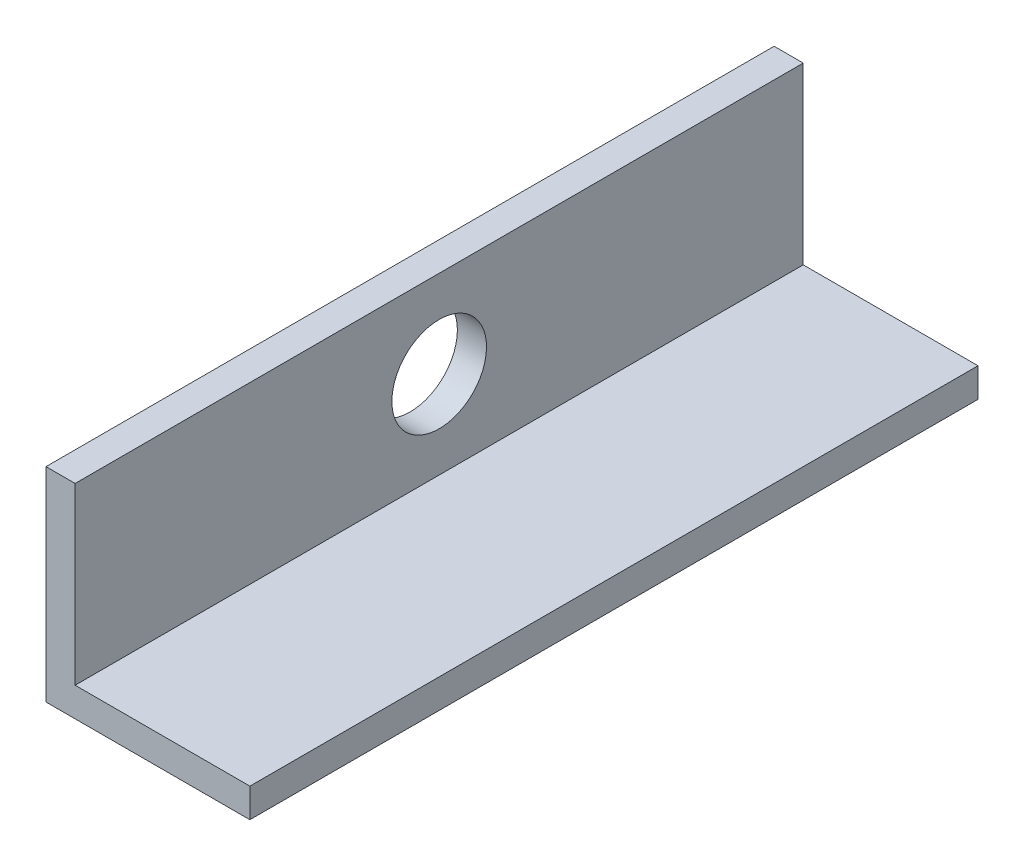
ISO-10303-21;
HEADER;
FILE_DESCRIPTION(('STEP AP214'),'2;1');
FILE_NAME('part.step','',(''),(''),'','','');
FILE_SCHEMA(('AUTOMOTIVE_DESIGN { 1 0 10303 214 1 1 1 1 }'));
ENDSEC;
DATA;
#1=APPLICATION_CONTEXT('core data for automotive mechanical design processes');
#2=APPLICATION_PROTOCOL_DEFINITION('international standard','automotive_design',2000,#1);
#3=PRODUCT_CONTEXT('',#1,'mechanical');
#4=PRODUCT('Part','Part','',(#3));
#5=PRODUCT_RELATED_PRODUCT_CATEGORY('part','',(#4));
#6=PRODUCT_DEFINITION_FORMATION('','',#4);
#7=PRODUCT_DEFINITION_CONTEXT('part definition',#1,'design');
#8=PRODUCT_DEFINITION('design','',#6,#7);
#9=PRODUCT_DEFINITION_SHAPE('','',#8);
#10=(LENGTH_UNIT() NAMED_UNIT(*) SI_UNIT(.MILLI.,.METRE.));
#11=(NAMED_UNIT(*) PLANE_ANGLE_UNIT() SI_UNIT($,.RADIAN.));
#12=(NAMED_UNIT(*) SI_UNIT($,.STERADIAN.) SOLID_ANGLE_UNIT());
#13=UNCERTAINTY_MEASURE_WITH_UNIT(LENGTH_MEASURE(1.E-05),#10,'distance_accuracy_value','');
#14=(GEOMETRIC_REPRESENTATION_CONTEXT(3) GLOBAL_UNCERTAINTY_ASSIGNED_CONTEXT((#13)) GLOBAL_UNIT_ASSIGNED_CONTEXT((#10,
#11,#12)) REPRESENTATION_CONTEXT('',''));
#15=CARTESIAN_POINT('',(0.,0.,0.));
#16=DIRECTION('',(0.,0.,1.));
#17=DIRECTION('',(1.,0.,0.));
#18=AXIS2_PLACEMENT_3D('',#15,#16,#17);
#19=CARTESIAN_POINT('',(14.,0.,50.));
#20=DIRECTION('',(0.,1.,0.));
#21=DIRECTION('',(-1.,0.,0.));
#22=AXIS2_PLACEMENT_3D('',#19,#20,#21);
#23=PLANE('',#22);
#24=DIRECTION('',(1.,0.,0.));
#25=VECTOR('',#24,1.);
#26=CARTESIAN_POINT('',(14.,0.,0.));
#27=LINE('',#26,#25);
#28=CARTESIAN_POINT('',(0.,0.,0.));
#29=VERTEX_POINT('',#28);
#30=CARTESIAN_POINT('',(14.,0.,0.));
#31=VERTEX_POINT('',#30);
#32=EDGE_CURVE('E131',#29,#31,#27,.T.);
#33=ORIENTED_EDGE('',*,*,#32,.T.);
#34=DIRECTION('',(0.,0.,-1.));
#35=VECTOR('',#34,1.);
#36=CARTESIAN_POINT('',(14.,0.,50.));
#37=LINE('',#36,#35);
#38=CARTESIAN_POINT('',(14.,0.,50.));
#39=VERTEX_POINT('',#38);
#40=EDGE_CURVE('E11',#39,#31,#37,.T.);
#41=ORIENTED_EDGE('',*,*,#40,.F.);
#42=DIRECTION('',(1.,0.,0.));
#43=VECTOR('',#42,1.);
#44=CARTESIAN_POINT('',(14.,0.,50.));
#45=LINE('',#44,#43);
#46=CARTESIAN_POINT('',(0.,0.,50.));
#47=VERTEX_POINT('',#46);
#48=EDGE_CURVE('E147',#47,#39,#45,.T.);
#49=ORIENTED_EDGE('',*,*,#48,.F.);
#50=DIRECTION('',(0.,0.,-1.));
#51=VECTOR('',#50,1.);
#52=CARTESIAN_POINT('',(0.,0.,50.));
#53=LINE('',#52,#51);
#54=EDGE_CURVE('E127',#47,#29,#53,.T.);
#55=ORIENTED_EDGE('',*,*,#54,.T.);
#56=EDGE_LOOP('',(#33,#41,#49,#55));
#57=FACE_BOUND('',#56,.T.);
#58=ADVANCED_FACE('F41',(#57),#23,.F.);
#59=CARTESIAN_POINT('',(14.,2.,50.));
#60=DIRECTION('',(-1.,0.,0.));
#61=DIRECTION('',(0.,0.,1.));
#62=AXIS2_PLACEMENT_3D('',#59,#60,#61);
#63=PLANE('',#62);
#64=DIRECTION('',(0.,1.,0.));
#65=VECTOR('',#64,1.);
#66=CARTESIAN_POINT('',(14.,2.,0.));
#67=LINE('',#66,#65);
#68=CARTESIAN_POINT('',(14.,2.,0.));
#69=VERTEX_POINT('',#68);
#70=EDGE_CURVE('E135',#31,#69,#67,.T.);
#71=ORIENTED_EDGE('',*,*,#70,.T.);
#72=DIRECTION('',(0.,0.,-1.));
#73=VECTOR('',#72,1.);
#74=CARTESIAN_POINT('',(14.,2.,50.));
#75=LINE('',#74,#73);
#76=CARTESIAN_POINT('',(14.,2.,50.));
#77=VERTEX_POINT('',#76);
#78=EDGE_CURVE('E51',#77,#69,#75,.T.);
#79=ORIENTED_EDGE('',*,*,#78,.F.);
#80=DIRECTION('',(0.,1.,0.));
#81=VECTOR('',#80,1.);
#82=CARTESIAN_POINT('',(14.,2.,50.));
#83=LINE('',#82,#81);
#84=EDGE_CURVE('E96',#39,#77,#83,.T.);
#85=ORIENTED_EDGE('',*,*,#84,.F.);
#86=ORIENTED_EDGE('',*,*,#40,.T.);
#87=EDGE_LOOP('',(#71,#79,#85,#86));
#88=FACE_BOUND('',#87,.T.);
#89=ADVANCED_FACE('F178',(#88),#63,.F.);
#90=CARTESIAN_POINT('',(2.,2.,50.));
#91=DIRECTION('',(0.,-1.,0.));
#92=DIRECTION('',(1.,0.,0.));
#93=AXIS2_PLACEMENT_3D('',#90,#91,#92);
#94=PLANE('',#93);
#95=DIRECTION('',(-1.,0.,0.));
#96=VECTOR('',#95,1.);
#97=CARTESIAN_POINT('',(2.,2.,0.));
#98=LINE('',#97,#96);
#99=CARTESIAN_POINT('',(2.,2.,0.));
#100=VERTEX_POINT('',#99);
#101=EDGE_CURVE('E138',#69,#100,#98,.T.);
#102=ORIENTED_EDGE('',*,*,#101,.T.);
#103=DIRECTION('',(0.,0.,-1.));
#104=VECTOR('',#103,1.);
#105=CARTESIAN_POINT('',(2.,2.,50.));
#106=LINE('',#105,#104);
#107=CARTESIAN_POINT('',(2.,2.,50.));
#108=VERTEX_POINT('',#107);
#109=EDGE_CURVE('E120',#108,#100,#106,.T.);
#110=ORIENTED_EDGE('',*,*,#109,.F.);
#111=DIRECTION('',(-1.,0.,0.));
#112=VECTOR('',#111,1.);
#113=CARTESIAN_POINT('',(2.,2.,50.));
#114=LINE('',#113,#112);
#115=EDGE_CURVE('E109',#77,#108,#114,.T.);
#116=ORIENTED_EDGE('',*,*,#115,.F.);
#117=ORIENTED_EDGE('',*,*,#78,.T.);
#118=EDGE_LOOP('',(#102,#110,#116,#117));
#119=FACE_BOUND('',#118,.T.);
#120=ADVANCED_FACE('F158',(#119),#94,.F.);
#121=CARTESIAN_POINT('',(2.,14.,50.));
#122=DIRECTION('',(-1.,0.,0.));
#123=DIRECTION('',(0.,-1.,0.));
#124=AXIS2_PLACEMENT_3D('',#121,#122,#123);
#125=PLANE('',#124);
#126=CARTESIAN_POINT('',(2.,8.,25.));
#127=DIRECTION('',(1.,0.,0.));
#128=DIRECTION('',(0.,1.,0.));
#129=AXIS2_PLACEMENT_3D('',#126,#127,#128);
#130=CIRCLE('',#129,3.25);
#131=CARTESIAN_POINT('',(2.,11.25,25.));
#132=VERTEX_POINT('',#131);
#133=EDGE_CURVE('E193',#132,#132,#130,.T.);
#134=ORIENTED_EDGE('',*,*,#133,.F.);
#135=EDGE_LOOP('',(#134));
#136=FACE_BOUND('',#135,.T.);
#137=DIRECTION('',(0.,1.,0.));
#138=VECTOR('',#137,1.);
#139=CARTESIAN_POINT('',(2.,14.,0.));
#140=LINE('',#139,#138);
#141=CARTESIAN_POINT('',(2.,14.,0.));
#142=VERTEX_POINT('',#141);
#143=EDGE_CURVE('E118',#100,#142,#140,.T.);
#144=ORIENTED_EDGE('',*,*,#143,.T.);
#145=DIRECTION('',(0.,0.,-1.));
#146=VECTOR('',#145,1.);
#147=CARTESIAN_POINT('',(2.,14.,50.));
#148=LINE('',#147,#146);
#149=CARTESIAN_POINT('',(2.,14.,50.));
#150=VERTEX_POINT('',#149);
#151=EDGE_CURVE('E115',#150,#142,#148,.T.);
#152=ORIENTED_EDGE('',*,*,#151,.F.);
#153=DIRECTION('',(0.,1.,0.));
#154=VECTOR('',#153,1.);
#155=CARTESIAN_POINT('',(2.,14.,50.));
#156=LINE('',#155,#154);
#157=EDGE_CURVE('E103',#108,#150,#156,.T.);
#158=ORIENTED_EDGE('',*,*,#157,.F.);
#159=ORIENTED_EDGE('',*,*,#109,.T.);
#160=EDGE_LOOP('',(#144,#152,#158,#159));
#161=FACE_BOUND('',#160,.T.);
#162=ADVANCED_FACE('F116',(#136,#161),#125,.F.);
#163=CARTESIAN_POINT('',(0.,14.,50.));
#164=DIRECTION('',(0.,-1.,0.));
#165=DIRECTION('',(0.,0.,-1.));
#166=AXIS2_PLACEMENT_3D('',#163,#164,#165);
#167=PLANE('',#166);
#168=DIRECTION('',(-1.,0.,0.));
#169=VECTOR('',#168,1.);
#170=CARTESIAN_POINT('',(0.,14.,0.));
#171=LINE('',#170,#169);
#172=CARTESIAN_POINT('',(0.,14.,0.));
#173=VERTEX_POINT('',#172);
#174=EDGE_CURVE('E82',#142,#173,#171,.T.);
#175=ORIENTED_EDGE('',*,*,#174,.T.);
#176=DIRECTION('',(0.,0.,-1.));
#177=VECTOR('',#176,1.);
#178=CARTESIAN_POINT('',(0.,14.,50.));
#179=LINE('',#178,#177);
#180=CARTESIAN_POINT('',(0.,14.,50.));
#181=VERTEX_POINT('',#180);
#182=EDGE_CURVE('E121',#181,#173,#179,.T.);
#183=ORIENTED_EDGE('',*,*,#182,.F.);
#184=DIRECTION('',(-1.,0.,0.));
#185=VECTOR('',#184,1.);
#186=CARTESIAN_POINT('',(0.,14.,50.));
#187=LINE('',#186,#185);
#188=EDGE_CURVE('E107',#150,#181,#187,.T.);
#189=ORIENTED_EDGE('',*,*,#188,.F.);
#190=ORIENTED_EDGE('',*,*,#151,.T.);
#191=EDGE_LOOP('',(#175,#183,#189,#190));
#192=FACE_BOUND('',#191,.T.);
#193=ADVANCED_FACE('F123',(#192),#167,.F.);
#194=CARTESIAN_POINT('',(0.,0.,50.));
#195=DIRECTION('',(1.,0.,0.));
#196=DIRECTION('',(0.,0.,-1.));
#197=AXIS2_PLACEMENT_3D('',#194,#195,#196);
#198=PLANE('',#197);
#199=CARTESIAN_POINT('',(0.,8.,25.));
#200=DIRECTION('',(1.,0.,0.));
#201=DIRECTION('',(0.,0.,-1.));
#202=AXIS2_PLACEMENT_3D('',#199,#200,#201);
#203=CIRCLE('',#202,3.25);
#204=CARTESIAN_POINT('',(0.,8.,21.75));
#205=VERTEX_POINT('',#204);
#206=EDGE_CURVE('E44',#205,#205,#203,.T.);
#207=ORIENTED_EDGE('',*,*,#206,.T.);
#208=EDGE_LOOP('',(#207));
#209=FACE_BOUND('',#208,.T.);
#210=DIRECTION('',(0.,-1.,0.));
#211=VECTOR('',#210,1.);
#212=CARTESIAN_POINT('',(0.,0.,0.));
#213=LINE('',#212,#211);
#214=EDGE_CURVE('E88',#173,#29,#213,.T.);
#215=ORIENTED_EDGE('',*,*,#214,.T.);
#216=ORIENTED_EDGE('',*,*,#54,.F.);
#217=DIRECTION('',(0.,-1.,0.));
#218=VECTOR('',#217,1.);
#219=CARTESIAN_POINT('',(0.,0.,50.));
#220=LINE('',#219,#218);
#221=EDGE_CURVE('E59',#181,#47,#220,.T.);
#222=ORIENTED_EDGE('',*,*,#221,.F.);
#223=ORIENTED_EDGE('',*,*,#182,.T.);
#224=EDGE_LOOP('',(#215,#216,#222,#223));
#225=FACE_BOUND('',#224,.T.);
#226=ADVANCED_FACE('F165',(#209,#225),#198,.F.);
#227=CARTESIAN_POINT('',(0.,0.,50.));
#228=DIRECTION('',(0.,0.,-1.));
#229=DIRECTION('',(-1.,0.,0.));
#230=AXIS2_PLACEMENT_3D('',#227,#228,#229);
#231=PLANE('',#230);
#232=ORIENTED_EDGE('',*,*,#48,.T.);
#233=ORIENTED_EDGE('',*,*,#84,.T.);
#234=ORIENTED_EDGE('',*,*,#115,.T.);
#235=ORIENTED_EDGE('',*,*,#157,.T.);
#236=ORIENTED_EDGE('',*,*,#188,.T.);
#237=ORIENTED_EDGE('',*,*,#221,.T.);
#238=EDGE_LOOP('',(#232,#233,#234,#235,#236,#237));
#239=FACE_BOUND('',#238,.T.);
#240=ADVANCED_FACE('F105',(#239),#231,.F.);
#241=CARTESIAN_POINT('',(0.,0.,0.));
#242=DIRECTION('',(0.,0.,-1.));
#243=DIRECTION('',(-1.,0.,0.));
#244=AXIS2_PLACEMENT_3D('',#241,#242,#243);
#245=PLANE('',#244);
#246=ORIENTED_EDGE('',*,*,#32,.F.);
#247=ORIENTED_EDGE('',*,*,#214,.F.);
#248=ORIENTED_EDGE('',*,*,#174,.F.);
#249=ORIENTED_EDGE('',*,*,#143,.F.);
#250=ORIENTED_EDGE('',*,*,#101,.F.);
#251=ORIENTED_EDGE('',*,*,#70,.F.);
#252=EDGE_LOOP('',(#246,#247,#248,#249,#250,#251));
#253=FACE_BOUND('',#252,.T.);
#254=ADVANCED_FACE('F161',(#253),#245,.T.);
#255=CARTESIAN_POINT('',(-48.,8.,25.));
#256=DIRECTION('',(1.,0.,0.));
#257=DIRECTION('',(0.,1.,0.));
#258=AXIS2_PLACEMENT_3D('',#255,#256,#257);
#259=CYLINDRICAL_SURFACE('',#258,3.25);
#260=ORIENTED_EDGE('',*,*,#133,.T.);
#261=EDGE_LOOP('',(#260));
#262=FACE_BOUND('',#261,.T.);
#263=ORIENTED_EDGE('',*,*,#206,.F.);
#264=EDGE_LOOP('',(#263));
#265=FACE_BOUND('',#264,.T.);
#266=ADVANCED_FACE('F205',(#262,#265),#259,.F.);
#267=CLOSED_SHELL('',(#58,#89,#120,#162,#193,#226,#240,#254,#266));
#268=MANIFOLD_SOLID_BREP('B2',#267);
#269=ADVANCED_BREP_SHAPE_REPRESENTATION('',(#18,#268),#14);
#270=SHAPE_DEFINITION_REPRESENTATION(#9,#269);
ENDSEC;
END-ISO-10303-21;
